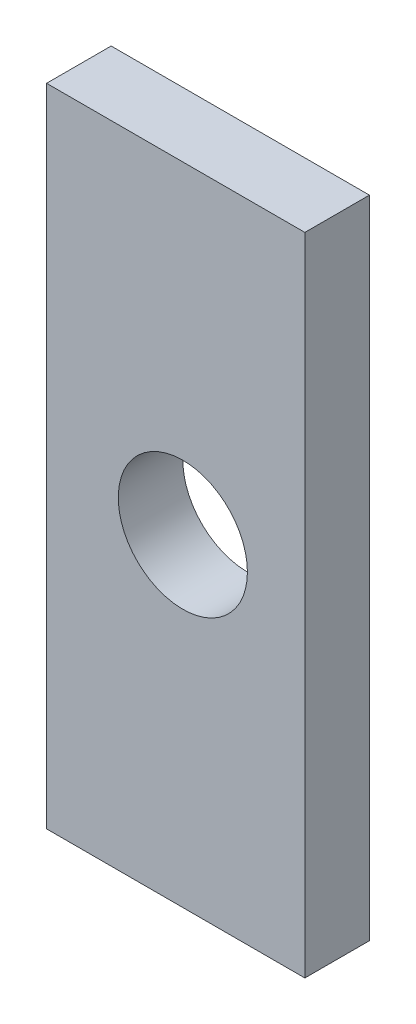
ISO-10303-21;
HEADER;
FILE_DESCRIPTION(('STEP AP214'),'2;1');
FILE_NAME('part.step','',(''),(''),'','','');
FILE_SCHEMA(('AUTOMOTIVE_DESIGN { 1 0 10303 214 1 1 1 1 }'));
ENDSEC;
DATA;
#1=APPLICATION_CONTEXT('core data for automotive mechanical design processes');
#2=APPLICATION_PROTOCOL_DEFINITION('international standard','automotive_design',2000,#1);
#3=PRODUCT_CONTEXT('',#1,'mechanical');
#4=PRODUCT('Part','Part','',(#3));
#5=PRODUCT_RELATED_PRODUCT_CATEGORY('part','',(#4));
#6=PRODUCT_DEFINITION_FORMATION('','',#4);
#7=PRODUCT_DEFINITION_CONTEXT('part definition',#1,'design');
#8=PRODUCT_DEFINITION('design','',#6,#7);
#9=PRODUCT_DEFINITION_SHAPE('','',#8);
#10=(LENGTH_UNIT() NAMED_UNIT(*) SI_UNIT(.MILLI.,.METRE.));
#11=(NAMED_UNIT(*) PLANE_ANGLE_UNIT() SI_UNIT($,.RADIAN.));
#12=(NAMED_UNIT(*) SI_UNIT($,.STERADIAN.) SOLID_ANGLE_UNIT());
#13=UNCERTAINTY_MEASURE_WITH_UNIT(LENGTH_MEASURE(1.E-05),#10,'distance_accuracy_value','');
#14=(GEOMETRIC_REPRESENTATION_CONTEXT(3) GLOBAL_UNCERTAINTY_ASSIGNED_CONTEXT((#13)) GLOBAL_UNIT_ASSIGNED_CONTEXT((#10,
#11,#12)) REPRESENTATION_CONTEXT('',''));
#15=CARTESIAN_POINT('',(0.,0.,0.));
#16=DIRECTION('',(0.,0.,1.));
#17=DIRECTION('',(1.,0.,0.));
#18=AXIS2_PLACEMENT_3D('',#15,#16,#17);
#19=CARTESIAN_POINT('',(-211.525120391001,-199.237379693634,-3.175));
#20=DIRECTION('',(1.,0.,0.));
#21=DIRECTION('',(0.,0.,-1.));
#22=AXIS2_PLACEMENT_3D('',#19,#20,#21);
#23=PLANE('',#22);
#24=DIRECTION('',(0.,1.,0.));
#25=VECTOR('',#24,1.);
#26=CARTESIAN_POINT('',(-211.525120391001,-199.237379693634,0.));
#27=LINE('',#26,#25);
#28=CARTESIAN_POINT('',(-211.525120391001,-199.237379693634,0.));
#29=VERTEX_POINT('',#28);
#30=CARTESIAN_POINT('',(-211.525120391001,-167.487379693634,0.));
#31=VERTEX_POINT('',#30);
#32=EDGE_CURVE('E106',#29,#31,#27,.T.);
#33=ORIENTED_EDGE('',*,*,#32,.F.);
#34=DIRECTION('',(0.,0.,1.));
#35=VECTOR('',#34,1.);
#36=CARTESIAN_POINT('',(-211.525120391001,-199.237379693634,-3.175));
#37=LINE('',#36,#35);
#38=CARTESIAN_POINT('',(-211.525120391001,-199.237379693634,-3.175));
#39=VERTEX_POINT('',#38);
#40=EDGE_CURVE('E11',#39,#29,#37,.T.);
#41=ORIENTED_EDGE('',*,*,#40,.F.);
#42=DIRECTION('',(0.,1.,0.));
#43=VECTOR('',#42,1.);
#44=CARTESIAN_POINT('',(-211.525120391001,-199.237379693634,-3.175));
#45=LINE('',#44,#43);
#46=CARTESIAN_POINT('',(-211.525120391001,-167.487379693634,-3.175));
#47=VERTEX_POINT('',#46);
#48=EDGE_CURVE('E99',#39,#47,#45,.T.);
#49=ORIENTED_EDGE('',*,*,#48,.T.);
#50=DIRECTION('',(0.,0.,1.));
#51=VECTOR('',#50,1.);
#52=CARTESIAN_POINT('',(-211.525120391001,-167.487379693634,-3.175));
#53=LINE('',#52,#51);
#54=EDGE_CURVE('E44',#47,#31,#53,.T.);
#55=ORIENTED_EDGE('',*,*,#54,.T.);
#56=EDGE_LOOP('',(#33,#41,#49,#55));
#57=FACE_BOUND('',#56,.T.);
#58=ADVANCED_FACE('F41',(#57),#23,.T.);
#59=CARTESIAN_POINT('',(-224.225120391001,-199.237379693634,-3.175));
#60=DIRECTION('',(0.,-1.,0.));
#61=DIRECTION('',(0.,0.,-1.));
#62=AXIS2_PLACEMENT_3D('',#59,#60,#61);
#63=PLANE('',#62);
#64=DIRECTION('',(1.,0.,0.));
#65=VECTOR('',#64,1.);
#66=CARTESIAN_POINT('',(-224.225120391001,-199.237379693634,0.));
#67=LINE('',#66,#65);
#68=CARTESIAN_POINT('',(-224.225120391001,-199.237379693634,0.));
#69=VERTEX_POINT('',#68);
#70=EDGE_CURVE('E101',#69,#29,#67,.T.);
#71=ORIENTED_EDGE('',*,*,#70,.F.);
#72=DIRECTION('',(0.,0.,1.));
#73=VECTOR('',#72,1.);
#74=CARTESIAN_POINT('',(-224.225120391001,-199.237379693634,-3.175));
#75=LINE('',#74,#73);
#76=CARTESIAN_POINT('',(-224.225120391001,-199.237379693634,-3.175));
#77=VERTEX_POINT('',#76);
#78=EDGE_CURVE('E50',#77,#69,#75,.T.);
#79=ORIENTED_EDGE('',*,*,#78,.F.);
#80=DIRECTION('',(1.,0.,0.));
#81=VECTOR('',#80,1.);
#82=CARTESIAN_POINT('',(-224.225120391001,-199.237379693634,-3.175));
#83=LINE('',#82,#81);
#84=EDGE_CURVE('E96',#77,#39,#83,.T.);
#85=ORIENTED_EDGE('',*,*,#84,.T.);
#86=ORIENTED_EDGE('',*,*,#40,.T.);
#87=EDGE_LOOP('',(#71,#79,#85,#86));
#88=FACE_BOUND('',#87,.T.);
#89=ADVANCED_FACE('F117',(#88),#63,.T.);
#90=CARTESIAN_POINT('',(-224.225120391001,-167.487379693634,-3.175));
#91=DIRECTION('',(-1.,0.,0.));
#92=DIRECTION('',(0.,0.,1.));
#93=AXIS2_PLACEMENT_3D('',#90,#91,#92);
#94=PLANE('',#93);
#95=DIRECTION('',(0.,-1.,0.));
#96=VECTOR('',#95,1.);
#97=CARTESIAN_POINT('',(-224.225120391001,-167.487379693634,0.));
#98=LINE('',#97,#96);
#99=CARTESIAN_POINT('',(-224.225120391001,-167.487379693634,0.));
#100=VERTEX_POINT('',#99);
#101=EDGE_CURVE('E91',#100,#69,#98,.T.);
#102=ORIENTED_EDGE('',*,*,#101,.F.);
#103=DIRECTION('',(0.,0.,1.));
#104=VECTOR('',#103,1.);
#105=CARTESIAN_POINT('',(-224.225120391001,-167.487379693634,-3.175));
#106=LINE('',#105,#104);
#107=CARTESIAN_POINT('',(-224.225120391001,-167.487379693634,-3.175));
#108=VERTEX_POINT('',#107);
#109=EDGE_CURVE('E86',#108,#100,#106,.T.);
#110=ORIENTED_EDGE('',*,*,#109,.F.);
#111=DIRECTION('',(0.,-1.,0.));
#112=VECTOR('',#111,1.);
#113=CARTESIAN_POINT('',(-224.225120391001,-167.487379693634,-3.175));
#114=LINE('',#113,#112);
#115=EDGE_CURVE('E89',#108,#77,#114,.T.);
#116=ORIENTED_EDGE('',*,*,#115,.T.);
#117=ORIENTED_EDGE('',*,*,#78,.T.);
#118=EDGE_LOOP('',(#102,#110,#116,#117));
#119=FACE_BOUND('',#118,.T.);
#120=ADVANCED_FACE('F88',(#119),#94,.T.);
#121=CARTESIAN_POINT('',(-211.525120391001,-167.487379693634,-3.175));
#122=DIRECTION('',(0.,1.,0.));
#123=DIRECTION('',(0.,0.,1.));
#124=AXIS2_PLACEMENT_3D('',#121,#122,#123);
#125=PLANE('',#124);
#126=DIRECTION('',(-1.,0.,0.));
#127=VECTOR('',#126,1.);
#128=CARTESIAN_POINT('',(-211.525120391001,-167.487379693634,0.));
#129=LINE('',#128,#127);
#130=EDGE_CURVE('E109',#31,#100,#129,.T.);
#131=ORIENTED_EDGE('',*,*,#130,.F.);
#132=ORIENTED_EDGE('',*,*,#54,.F.);
#133=DIRECTION('',(-1.,0.,0.));
#134=VECTOR('',#133,1.);
#135=CARTESIAN_POINT('',(-211.525120391001,-167.487379693634,-3.175));
#136=LINE('',#135,#134);
#137=EDGE_CURVE('E95',#47,#108,#136,.T.);
#138=ORIENTED_EDGE('',*,*,#137,.T.);
#139=ORIENTED_EDGE('',*,*,#109,.T.);
#140=EDGE_LOOP('',(#131,#132,#138,#139));
#141=FACE_BOUND('',#140,.T.);
#142=ADVANCED_FACE('F98',(#141),#125,.T.);
#143=CARTESIAN_POINT('',(0.,0.,-3.175));
#144=DIRECTION('',(0.,0.,1.));
#145=DIRECTION('',(1.,0.,0.));
#146=AXIS2_PLACEMENT_3D('',#143,#144,#145);
#147=PLANE('',#146);
#148=CARTESIAN_POINT('',(-217.525120391001,-183.362379693634,-3.175));
#149=DIRECTION('',(0.,0.,1.));
#150=DIRECTION('',(1.,0.,0.));
#151=AXIS2_PLACEMENT_3D('',#148,#149,#150);
#152=CIRCLE('',#151,3.17499999999997);
#153=CARTESIAN_POINT('',(-214.350120391001,-183.362379693634,-3.175));
#154=VERTEX_POINT('',#153);
#155=EDGE_CURVE('E110',#154,#154,#152,.T.);
#156=ORIENTED_EDGE('',*,*,#155,.T.);
#157=EDGE_LOOP('',(#156));
#158=FACE_BOUND('',#157,.T.);
#159=ORIENTED_EDGE('',*,*,#48,.F.);
#160=ORIENTED_EDGE('',*,*,#84,.F.);
#161=ORIENTED_EDGE('',*,*,#115,.F.);
#162=ORIENTED_EDGE('',*,*,#137,.F.);
#163=EDGE_LOOP('',(#159,#160,#161,#162));
#164=FACE_BOUND('',#163,.T.);
#165=ADVANCED_FACE('F94',(#158,#164),#147,.F.);
#166=CARTESIAN_POINT('',(0.,0.,0.));
#167=DIRECTION('',(0.,0.,1.));
#168=DIRECTION('',(1.,0.,0.));
#169=AXIS2_PLACEMENT_3D('',#166,#167,#168);
#170=PLANE('',#169);
#171=CARTESIAN_POINT('',(-217.525120391001,-183.362379693634,0.));
#172=DIRECTION('',(0.,0.,1.));
#173=DIRECTION('',(1.,0.,0.));
#174=AXIS2_PLACEMENT_3D('',#171,#172,#173);
#175=CIRCLE('',#174,3.17499999999997);
#176=CARTESIAN_POINT('',(-214.350120391001,-183.362379693634,0.));
#177=VERTEX_POINT('',#176);
#178=EDGE_CURVE('E147',#177,#177,#175,.T.);
#179=ORIENTED_EDGE('',*,*,#178,.F.);
#180=EDGE_LOOP('',(#179));
#181=FACE_BOUND('',#180,.T.);
#182=ORIENTED_EDGE('',*,*,#32,.T.);
#183=ORIENTED_EDGE('',*,*,#130,.T.);
#184=ORIENTED_EDGE('',*,*,#101,.T.);
#185=ORIENTED_EDGE('',*,*,#70,.T.);
#186=EDGE_LOOP('',(#182,#183,#184,#185));
#187=FACE_BOUND('',#186,.T.);
#188=ADVANCED_FACE('F116',(#181,#187),#170,.T.);
#189=CARTESIAN_POINT('',(-217.525120391001,-183.362379693634,-3.175));
#190=DIRECTION('',(0.,0.,1.));
#191=DIRECTION('',(1.,0.,0.));
#192=AXIS2_PLACEMENT_3D('',#189,#190,#191);
#193=CYLINDRICAL_SURFACE('',#192,3.17499999999997);
#194=ORIENTED_EDGE('',*,*,#155,.F.);
#195=EDGE_LOOP('',(#194));
#196=FACE_BOUND('',#195,.T.);
#197=ORIENTED_EDGE('',*,*,#178,.T.);
#198=EDGE_LOOP('',(#197));
#199=FACE_BOUND('',#198,.T.);
#200=ADVANCED_FACE('F135',(#196,#199),#193,.F.);
#201=CLOSED_SHELL('',(#58,#89,#120,#142,#165,#188,#200));
#202=MANIFOLD_SOLID_BREP('B2',#201);
#203=ADVANCED_BREP_SHAPE_REPRESENTATION('',(#18,#202),#14);
#204=SHAPE_DEFINITION_REPRESENTATION(#9,#203);
ENDSEC;
END-ISO-10303-21;
